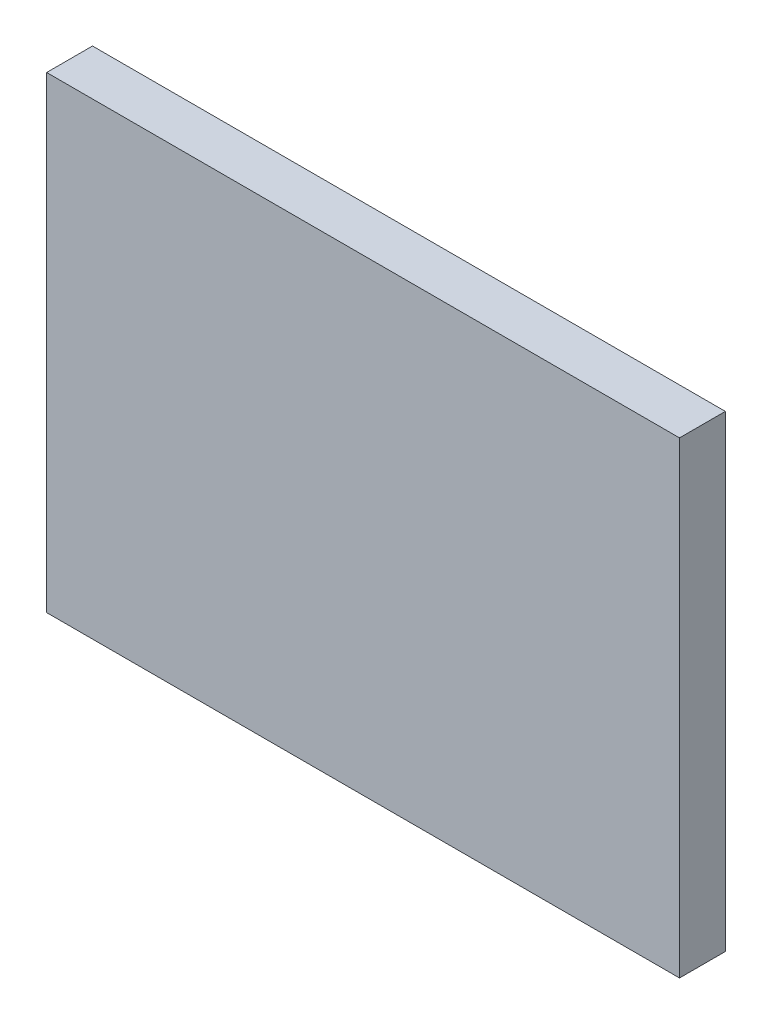
ISO-10303-21;
HEADER;
FILE_DESCRIPTION(('STEP AP214'),'2;1');
FILE_NAME('part.step','',(''),(''),'','','');
FILE_SCHEMA(('AUTOMOTIVE_DESIGN { 1 0 10303 214 1 1 1 1 }'));
ENDSEC;
DATA;
#1=APPLICATION_CONTEXT('core data for automotive mechanical design processes');
#2=APPLICATION_PROTOCOL_DEFINITION('international standard','automotive_design',2000,#1);
#3=PRODUCT_CONTEXT('',#1,'mechanical');
#4=PRODUCT('Part','Part','',(#3));
#5=PRODUCT_RELATED_PRODUCT_CATEGORY('part','',(#4));
#6=PRODUCT_DEFINITION_FORMATION('','',#4);
#7=PRODUCT_DEFINITION_CONTEXT('part definition',#1,'design');
#8=PRODUCT_DEFINITION('design','',#6,#7);
#9=PRODUCT_DEFINITION_SHAPE('','',#8);
#10=(LENGTH_UNIT() NAMED_UNIT(*) SI_UNIT(.MILLI.,.METRE.));
#11=(NAMED_UNIT(*) PLANE_ANGLE_UNIT() SI_UNIT($,.RADIAN.));
#12=(NAMED_UNIT(*) SI_UNIT($,.STERADIAN.) SOLID_ANGLE_UNIT());
#13=UNCERTAINTY_MEASURE_WITH_UNIT(LENGTH_MEASURE(1.E-05),#10,'distance_accuracy_value','');
#14=(GEOMETRIC_REPRESENTATION_CONTEXT(3) GLOBAL_UNCERTAINTY_ASSIGNED_CONTEXT((#13)) GLOBAL_UNIT_ASSIGNED_CONTEXT((#10,
#11,#12)) REPRESENTATION_CONTEXT('',''));
#15=CARTESIAN_POINT('',(0.,0.,0.));
#16=DIRECTION('',(0.,0.,1.));
#17=DIRECTION('',(1.,0.,0.));
#18=AXIS2_PLACEMENT_3D('',#15,#16,#17);
#19=CARTESIAN_POINT('',(-41.3958175885105,20.2654210200925,5.));
#20=DIRECTION('',(1.,0.,0.));
#21=DIRECTION('',(0.,1.,0.));
#22=AXIS2_PLACEMENT_3D('',#19,#20,#21);
#23=PLANE('',#22);
#24=DIRECTION('',(0.,-1.,0.));
#25=VECTOR('',#24,1.);
#26=CARTESIAN_POINT('',(-41.3958175885105,20.2654210200925,0.));
#27=LINE('',#26,#25);
#28=CARTESIAN_POINT('',(-41.3958175885105,20.2654210200925,0.));
#29=VERTEX_POINT('',#28);
#30=CARTESIAN_POINT('',(-41.3958175885105,-30.7345789799075,0.));
#31=VERTEX_POINT('',#30);
#32=EDGE_CURVE('E94',#29,#31,#27,.T.);
#33=ORIENTED_EDGE('',*,*,#32,.T.);
#34=DIRECTION('',(0.,0.,-1.));
#35=VECTOR('',#34,1.);
#36=CARTESIAN_POINT('',(-41.3958175885105,-30.7345789799075,5.));
#37=LINE('',#36,#35);
#38=CARTESIAN_POINT('',(-41.3958175885105,-30.7345789799075,5.));
#39=VERTEX_POINT('',#38);
#40=EDGE_CURVE('E11',#39,#31,#37,.T.);
#41=ORIENTED_EDGE('',*,*,#40,.F.);
#42=DIRECTION('',(0.,-1.,0.));
#43=VECTOR('',#42,1.);
#44=CARTESIAN_POINT('',(-41.3958175885105,20.2654210200925,5.));
#45=LINE('',#44,#43);
#46=CARTESIAN_POINT('',(-41.3958175885105,20.2654210200925,5.));
#47=VERTEX_POINT('',#46);
#48=EDGE_CURVE('E82',#47,#39,#45,.T.);
#49=ORIENTED_EDGE('',*,*,#48,.F.);
#50=DIRECTION('',(0.,0.,-1.));
#51=VECTOR('',#50,1.);
#52=CARTESIAN_POINT('',(-41.3958175885105,20.2654210200925,5.));
#53=LINE('',#52,#51);
#54=EDGE_CURVE('E90',#47,#29,#53,.T.);
#55=ORIENTED_EDGE('',*,*,#54,.T.);
#56=EDGE_LOOP('',(#33,#41,#49,#55));
#57=FACE_BOUND('',#56,.T.);
#58=ADVANCED_FACE('F31',(#57),#23,.F.);
#59=CARTESIAN_POINT('',(-41.3958175885105,-30.7345789799075,5.));
#60=DIRECTION('',(0.,1.,0.));
#61=DIRECTION('',(0.,0.,1.));
#62=AXIS2_PLACEMENT_3D('',#59,#60,#61);
#63=PLANE('',#62);
#64=DIRECTION('',(1.,0.,0.));
#65=VECTOR('',#64,1.);
#66=CARTESIAN_POINT('',(-41.3958175885105,-30.7345789799075,0.));
#67=LINE('',#66,#65);
#68=CARTESIAN_POINT('',(27.6041824114895,-30.7345789799075,0.));
#69=VERTEX_POINT('',#68);
#70=EDGE_CURVE('E86',#31,#69,#67,.T.);
#71=ORIENTED_EDGE('',*,*,#70,.T.);
#72=DIRECTION('',(0.,0.,-1.));
#73=VECTOR('',#72,1.);
#74=CARTESIAN_POINT('',(27.6041824114895,-30.7345789799075,5.));
#75=LINE('',#74,#73);
#76=CARTESIAN_POINT('',(27.6041824114895,-30.7345789799075,5.));
#77=VERTEX_POINT('',#76);
#78=EDGE_CURVE('E39',#77,#69,#75,.T.);
#79=ORIENTED_EDGE('',*,*,#78,.F.);
#80=DIRECTION('',(1.,0.,0.));
#81=VECTOR('',#80,1.);
#82=CARTESIAN_POINT('',(-41.3958175885105,-30.7345789799075,5.));
#83=LINE('',#82,#81);
#84=EDGE_CURVE('E77',#39,#77,#83,.T.);
#85=ORIENTED_EDGE('',*,*,#84,.F.);
#86=ORIENTED_EDGE('',*,*,#40,.T.);
#87=EDGE_LOOP('',(#71,#79,#85,#86));
#88=FACE_BOUND('',#87,.T.);
#89=ADVANCED_FACE('F85',(#88),#63,.F.);
#90=CARTESIAN_POINT('',(27.6041824114895,20.2654210200925,5.));
#91=DIRECTION('',(-1.,0.,0.));
#92=DIRECTION('',(0.,-1.,0.));
#93=AXIS2_PLACEMENT_3D('',#90,#91,#92);
#94=PLANE('',#93);
#95=DIRECTION('',(0.,1.,0.));
#96=VECTOR('',#95,1.);
#97=CARTESIAN_POINT('',(27.6041824114895,20.2654210200925,0.));
#98=LINE('',#97,#96);
#99=CARTESIAN_POINT('',(27.6041824114895,20.2654210200925,0.));
#100=VERTEX_POINT('',#99);
#101=EDGE_CURVE('E64',#69,#100,#98,.T.);
#102=ORIENTED_EDGE('',*,*,#101,.T.);
#103=DIRECTION('',(0.,0.,-1.));
#104=VECTOR('',#103,1.);
#105=CARTESIAN_POINT('',(27.6041824114895,20.2654210200925,5.));
#106=LINE('',#105,#104);
#107=CARTESIAN_POINT('',(27.6041824114895,20.2654210200925,5.));
#108=VERTEX_POINT('',#107);
#109=EDGE_CURVE('E87',#108,#100,#106,.T.);
#110=ORIENTED_EDGE('',*,*,#109,.F.);
#111=DIRECTION('',(0.,1.,0.));
#112=VECTOR('',#111,1.);
#113=CARTESIAN_POINT('',(27.6041824114895,20.2654210200925,5.));
#114=LINE('',#113,#112);
#115=EDGE_CURVE('E80',#77,#108,#114,.T.);
#116=ORIENTED_EDGE('',*,*,#115,.F.);
#117=ORIENTED_EDGE('',*,*,#78,.T.);
#118=EDGE_LOOP('',(#102,#110,#116,#117));
#119=FACE_BOUND('',#118,.T.);
#120=ADVANCED_FACE('F88',(#119),#94,.F.);
#121=CARTESIAN_POINT('',(-41.3958175885105,20.2654210200925,5.));
#122=DIRECTION('',(0.,-1.,0.));
#123=DIRECTION('',(1.,0.,0.));
#124=AXIS2_PLACEMENT_3D('',#121,#122,#123);
#125=PLANE('',#124);
#126=DIRECTION('',(-1.,0.,0.));
#127=VECTOR('',#126,1.);
#128=CARTESIAN_POINT('',(-41.3958175885105,20.2654210200925,0.));
#129=LINE('',#128,#127);
#130=EDGE_CURVE('E70',#100,#29,#129,.T.);
#131=ORIENTED_EDGE('',*,*,#130,.T.);
#132=ORIENTED_EDGE('',*,*,#54,.F.);
#133=DIRECTION('',(-1.,0.,0.));
#134=VECTOR('',#133,1.);
#135=CARTESIAN_POINT('',(-41.3958175885105,20.2654210200925,5.));
#136=LINE('',#135,#134);
#137=EDGE_CURVE('E47',#108,#47,#136,.T.);
#138=ORIENTED_EDGE('',*,*,#137,.F.);
#139=ORIENTED_EDGE('',*,*,#109,.T.);
#140=EDGE_LOOP('',(#131,#132,#138,#139));
#141=FACE_BOUND('',#140,.T.);
#142=ADVANCED_FACE('F101',(#141),#125,.F.);
#143=CARTESIAN_POINT('',(-41.3958175885105,-30.7345789799075,5.));
#144=DIRECTION('',(0.,0.,1.));
#145=DIRECTION('',(1.,0.,0.));
#146=AXIS2_PLACEMENT_3D('',#143,#144,#145);
#147=PLANE('',#146);
#148=ORIENTED_EDGE('',*,*,#48,.T.);
#149=ORIENTED_EDGE('',*,*,#84,.T.);
#150=ORIENTED_EDGE('',*,*,#115,.T.);
#151=ORIENTED_EDGE('',*,*,#137,.T.);
#152=EDGE_LOOP('',(#148,#149,#150,#151));
#153=FACE_BOUND('',#152,.T.);
#154=ADVANCED_FACE('F78',(#153),#147,.T.);
#155=CARTESIAN_POINT('',(-41.3958175885105,-30.7345789799075,0.));
#156=DIRECTION('',(0.,0.,1.));
#157=DIRECTION('',(1.,0.,0.));
#158=AXIS2_PLACEMENT_3D('',#155,#156,#157);
#159=PLANE('',#158);
#160=ORIENTED_EDGE('',*,*,#32,.F.);
#161=ORIENTED_EDGE('',*,*,#130,.F.);
#162=ORIENTED_EDGE('',*,*,#101,.F.);
#163=ORIENTED_EDGE('',*,*,#70,.F.);
#164=EDGE_LOOP('',(#160,#161,#162,#163));
#165=FACE_BOUND('',#164,.T.);
#166=ADVANCED_FACE('F104',(#165),#159,.F.);
#167=CLOSED_SHELL('',(#58,#89,#120,#142,#154,#166));
#168=MANIFOLD_SOLID_BREP('B2',#167);
#169=ADVANCED_BREP_SHAPE_REPRESENTATION('',(#18,#168),#14);
#170=SHAPE_DEFINITION_REPRESENTATION(#9,#169);
ENDSEC;
END-ISO-10303-21;
